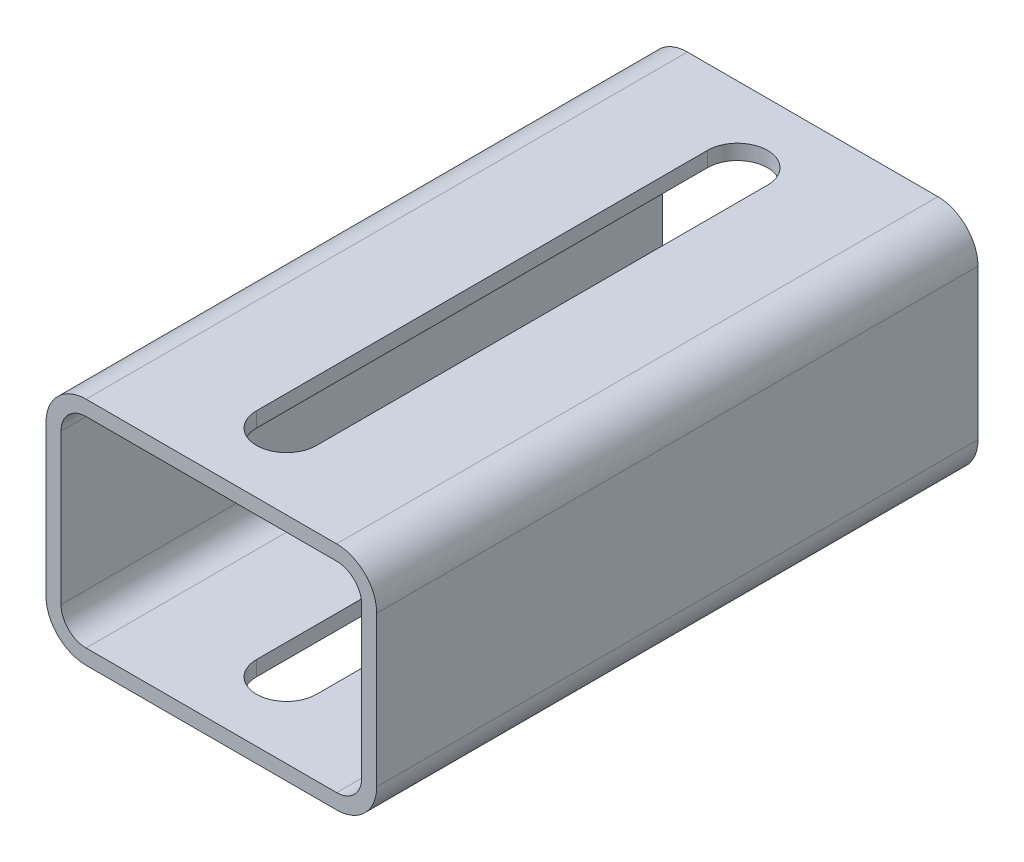
ISO-10303-21;
HEADER;
FILE_DESCRIPTION(('STEP AP214'),'2;1');
FILE_NAME('part.step','',(''),(''),'','','');
FILE_SCHEMA(('AUTOMOTIVE_DESIGN { 1 0 10303 214 1 1 1 1 }'));
ENDSEC;
DATA;
#1=APPLICATION_CONTEXT('core data for automotive mechanical design processes');
#2=APPLICATION_PROTOCOL_DEFINITION('international standard','automotive_design',2000,#1);
#3=PRODUCT_CONTEXT('',#1,'mechanical');
#4=PRODUCT('Part','Part','',(#3));
#5=PRODUCT_RELATED_PRODUCT_CATEGORY('part','',(#4));
#6=PRODUCT_DEFINITION_FORMATION('','',#4);
#7=PRODUCT_DEFINITION_CONTEXT('part definition',#1,'design');
#8=PRODUCT_DEFINITION('design','',#6,#7);
#9=PRODUCT_DEFINITION_SHAPE('','',#8);
#10=(LENGTH_UNIT() NAMED_UNIT(*) SI_UNIT(.MILLI.,.METRE.));
#11=(NAMED_UNIT(*) PLANE_ANGLE_UNIT() SI_UNIT($,.RADIAN.));
#12=(NAMED_UNIT(*) SI_UNIT($,.STERADIAN.) SOLID_ANGLE_UNIT());
#13=UNCERTAINTY_MEASURE_WITH_UNIT(LENGTH_MEASURE(1.E-05),#10,'distance_accuracy_value','');
#14=(GEOMETRIC_REPRESENTATION_CONTEXT(3) GLOBAL_UNCERTAINTY_ASSIGNED_CONTEXT((#13)) GLOBAL_UNIT_ASSIGNED_CONTEXT((#10,
#11,#12)) REPRESENTATION_CONTEXT('',''));
#15=CARTESIAN_POINT('',(0.,0.,0.));
#16=DIRECTION('',(0.,0.,1.));
#17=DIRECTION('',(1.,0.,0.));
#18=AXIS2_PLACEMENT_3D('',#15,#16,#17);
#19=CARTESIAN_POINT('',(25.,15.,60.));
#20=DIRECTION('',(0.,0.,-1.));
#21=DIRECTION('',(-1.,0.,0.));
#22=AXIS2_PLACEMENT_3D('',#19,#20,#21);
#23=PLANE('',#22);
#24=CARTESIAN_POINT('',(25.,15.,60.));
#25=DIRECTION('',(0.,0.,-1.));
#26=DIRECTION('',(-1.,0.,0.));
#27=AXIS2_PLACEMENT_3D('',#24,#25,#26);
#28=CIRCLE('',#27,8.);
#29=CARTESIAN_POINT('',(33.,15.,60.));
#30=VERTEX_POINT('',#29);
#31=CARTESIAN_POINT('',(25.,23.,60.));
#32=VERTEX_POINT('',#31);
#33=EDGE_CURVE('E403',#30,#32,#28,.F.);
#34=ORIENTED_EDGE('',*,*,#33,.T.);
#35=DIRECTION('',(-1.,0.,0.));
#36=VECTOR('',#35,1.);
#37=CARTESIAN_POINT('',(25.,23.,60.));
#38=LINE('',#37,#36);
#39=CARTESIAN_POINT('',(-25.,23.,60.));
#40=VERTEX_POINT('',#39);
#41=EDGE_CURVE('E407',#32,#40,#38,.T.);
#42=ORIENTED_EDGE('',*,*,#41,.T.);
#43=CARTESIAN_POINT('',(-25.,15.,60.));
#44=DIRECTION('',(0.,0.,-1.));
#45=DIRECTION('',(-1.,0.,0.));
#46=AXIS2_PLACEMENT_3D('',#43,#44,#45);
#47=CIRCLE('',#46,8.);
#48=CARTESIAN_POINT('',(-33.,15.,60.));
#49=VERTEX_POINT('',#48);
#50=EDGE_CURVE('E411',#40,#49,#47,.F.);
#51=ORIENTED_EDGE('',*,*,#50,.T.);
#52=DIRECTION('',(0.,-1.,0.));
#53=VECTOR('',#52,1.);
#54=CARTESIAN_POINT('',(-33.,15.,60.));
#55=LINE('',#54,#53);
#56=CARTESIAN_POINT('',(-33.,-15.,60.));
#57=VERTEX_POINT('',#56);
#58=EDGE_CURVE('E414',#49,#57,#55,.T.);
#59=ORIENTED_EDGE('',*,*,#58,.T.);
#60=CARTESIAN_POINT('',(-25.,-15.,60.));
#61=DIRECTION('',(0.,0.,-1.));
#62=DIRECTION('',(-1.,0.,0.));
#63=AXIS2_PLACEMENT_3D('',#60,#61,#62);
#64=CIRCLE('',#63,8.);
#65=CARTESIAN_POINT('',(-25.,-23.,60.));
#66=VERTEX_POINT('',#65);
#67=EDGE_CURVE('E417',#57,#66,#64,.F.);
#68=ORIENTED_EDGE('',*,*,#67,.T.);
#69=DIRECTION('',(1.,0.,0.));
#70=VECTOR('',#69,1.);
#71=CARTESIAN_POINT('',(25.,-23.,60.));
#72=LINE('',#71,#70);
#73=CARTESIAN_POINT('',(25.,-23.,60.));
#74=VERTEX_POINT('',#73);
#75=EDGE_CURVE('E420',#66,#74,#72,.T.);
#76=ORIENTED_EDGE('',*,*,#75,.T.);
#77=CARTESIAN_POINT('',(25.,-15.,60.));
#78=DIRECTION('',(0.,0.,-1.));
#79=DIRECTION('',(-1.,0.,0.));
#80=AXIS2_PLACEMENT_3D('',#77,#78,#79);
#81=CIRCLE('',#80,8.00000000000001);
#82=CARTESIAN_POINT('',(33.,-15.,60.));
#83=VERTEX_POINT('',#82);
#84=EDGE_CURVE('E423',#74,#83,#81,.F.);
#85=ORIENTED_EDGE('',*,*,#84,.T.);
#86=DIRECTION('',(0.,1.,0.));
#87=VECTOR('',#86,1.);
#88=CARTESIAN_POINT('',(33.,15.,60.));
#89=LINE('',#88,#87);
#90=EDGE_CURVE('E426',#83,#30,#89,.T.);
#91=ORIENTED_EDGE('',*,*,#90,.T.);
#92=EDGE_LOOP('',(#34,#42,#51,#59,#68,#76,#85,#91));
#93=FACE_BOUND('',#92,.T.);
#94=CARTESIAN_POINT('',(25.,15.,60.));
#95=DIRECTION('',(0.,0.,1.));
#96=DIRECTION('',(-1.,0.,0.));
#97=AXIS2_PLACEMENT_3D('',#94,#95,#96);
#98=CIRCLE('',#97,5.);
#99=CARTESIAN_POINT('',(30.,15.,60.));
#100=VERTEX_POINT('',#99);
#101=CARTESIAN_POINT('',(25.,20.,60.));
#102=VERTEX_POINT('',#101);
#103=EDGE_CURVE('E320',#100,#102,#98,.T.);
#104=ORIENTED_EDGE('',*,*,#103,.F.);
#105=DIRECTION('',(0.,1.,0.));
#106=VECTOR('',#105,1.);
#107=CARTESIAN_POINT('',(30.,15.,60.));
#108=LINE('',#107,#106);
#109=CARTESIAN_POINT('',(30.,-15.,60.));
#110=VERTEX_POINT('',#109);
#111=EDGE_CURVE('E343',#110,#100,#108,.T.);
#112=ORIENTED_EDGE('',*,*,#111,.F.);
#113=CARTESIAN_POINT('',(25.,-15.,60.));
#114=DIRECTION('',(0.,0.,1.));
#115=DIRECTION('',(1.,0.,0.));
#116=AXIS2_PLACEMENT_3D('',#113,#114,#115);
#117=CIRCLE('',#116,5.00000000000001);
#118=CARTESIAN_POINT('',(25.,-20.,60.));
#119=VERTEX_POINT('',#118);
#120=EDGE_CURVE('E339',#119,#110,#117,.T.);
#121=ORIENTED_EDGE('',*,*,#120,.F.);
#122=DIRECTION('',(1.,0.,0.));
#123=VECTOR('',#122,1.);
#124=CARTESIAN_POINT('',(-25.,-20.,60.));
#125=LINE('',#124,#123);
#126=CARTESIAN_POINT('',(-25.,-20.,60.));
#127=VERTEX_POINT('',#126);
#128=EDGE_CURVE('E336',#127,#119,#125,.T.);
#129=ORIENTED_EDGE('',*,*,#128,.F.);
#130=CARTESIAN_POINT('',(-25.,-15.,60.));
#131=DIRECTION('',(0.,0.,1.));
#132=DIRECTION('',(1.,0.,0.));
#133=AXIS2_PLACEMENT_3D('',#130,#131,#132);
#134=CIRCLE('',#133,5.);
#135=CARTESIAN_POINT('',(-30.,-15.,60.));
#136=VERTEX_POINT('',#135);
#137=EDGE_CURVE('E333',#136,#127,#134,.T.);
#138=ORIENTED_EDGE('',*,*,#137,.F.);
#139=DIRECTION('',(0.,-1.,0.));
#140=VECTOR('',#139,1.);
#141=CARTESIAN_POINT('',(-30.,15.,60.));
#142=LINE('',#141,#140);
#143=CARTESIAN_POINT('',(-30.,15.,60.));
#144=VERTEX_POINT('',#143);
#145=EDGE_CURVE('E330',#144,#136,#142,.T.);
#146=ORIENTED_EDGE('',*,*,#145,.F.);
#147=CARTESIAN_POINT('',(-25.,15.,60.));
#148=DIRECTION('',(0.,0.,1.));
#149=DIRECTION('',(1.,0.,0.));
#150=AXIS2_PLACEMENT_3D('',#147,#148,#149);
#151=CIRCLE('',#150,5.);
#152=CARTESIAN_POINT('',(-25.,20.,60.));
#153=VERTEX_POINT('',#152);
#154=EDGE_CURVE('E327',#153,#144,#151,.T.);
#155=ORIENTED_EDGE('',*,*,#154,.F.);
#156=DIRECTION('',(-1.,0.,0.));
#157=VECTOR('',#156,1.);
#158=CARTESIAN_POINT('',(-25.,20.,60.));
#159=LINE('',#158,#157);
#160=EDGE_CURVE('E323',#102,#153,#159,.T.);
#161=ORIENTED_EDGE('',*,*,#160,.F.);
#162=EDGE_LOOP('',(#104,#112,#121,#129,#138,#146,#155,#161));
#163=FACE_BOUND('',#162,.T.);
#164=ADVANCED_FACE('F86',(#93,#163),#23,.F.);
#165=CARTESIAN_POINT('',(25.,15.,-60.));
#166=DIRECTION('',(0.,0.,-1.));
#167=DIRECTION('',(-1.,0.,0.));
#168=AXIS2_PLACEMENT_3D('',#165,#166,#167);
#169=PLANE('',#168);
#170=CARTESIAN_POINT('',(25.,15.,-60.));
#171=DIRECTION('',(0.,0.,-1.));
#172=DIRECTION('',(-1.,0.,0.));
#173=AXIS2_PLACEMENT_3D('',#170,#171,#172);
#174=CIRCLE('',#173,8.);
#175=CARTESIAN_POINT('',(33.,15.,-60.));
#176=VERTEX_POINT('',#175);
#177=CARTESIAN_POINT('',(25.,23.,-60.));
#178=VERTEX_POINT('',#177);
#179=EDGE_CURVE('E402',#176,#178,#174,.F.);
#180=ORIENTED_EDGE('',*,*,#179,.F.);
#181=DIRECTION('',(0.,1.,0.));
#182=VECTOR('',#181,1.);
#183=CARTESIAN_POINT('',(33.,15.,-60.));
#184=LINE('',#183,#182);
#185=CARTESIAN_POINT('',(33.,-15.,-60.));
#186=VERTEX_POINT('',#185);
#187=EDGE_CURVE('E408',#186,#176,#184,.T.);
#188=ORIENTED_EDGE('',*,*,#187,.F.);
#189=CARTESIAN_POINT('',(25.,-15.,-60.));
#190=DIRECTION('',(0.,0.,-1.));
#191=DIRECTION('',(-1.,0.,0.));
#192=AXIS2_PLACEMENT_3D('',#189,#190,#191);
#193=CIRCLE('',#192,8.00000000000001);
#194=CARTESIAN_POINT('',(25.,-23.,-60.));
#195=VERTEX_POINT('',#194);
#196=EDGE_CURVE('E448',#195,#186,#193,.F.);
#197=ORIENTED_EDGE('',*,*,#196,.F.);
#198=DIRECTION('',(1.,0.,0.));
#199=VECTOR('',#198,1.);
#200=CARTESIAN_POINT('',(25.,-23.,-60.));
#201=LINE('',#200,#199);
#202=CARTESIAN_POINT('',(-25.,-23.,-60.));
#203=VERTEX_POINT('',#202);
#204=EDGE_CURVE('E445',#203,#195,#201,.T.);
#205=ORIENTED_EDGE('',*,*,#204,.F.);
#206=CARTESIAN_POINT('',(-25.,-15.,-60.));
#207=DIRECTION('',(0.,0.,-1.));
#208=DIRECTION('',(-1.,0.,0.));
#209=AXIS2_PLACEMENT_3D('',#206,#207,#208);
#210=CIRCLE('',#209,8.);
#211=CARTESIAN_POINT('',(-33.,-15.,-60.));
#212=VERTEX_POINT('',#211);
#213=EDGE_CURVE('E442',#212,#203,#210,.F.);
#214=ORIENTED_EDGE('',*,*,#213,.F.);
#215=DIRECTION('',(0.,-1.,0.));
#216=VECTOR('',#215,1.);
#217=CARTESIAN_POINT('',(-33.,15.,-60.));
#218=LINE('',#217,#216);
#219=CARTESIAN_POINT('',(-33.,15.,-60.));
#220=VERTEX_POINT('',#219);
#221=EDGE_CURVE('E439',#220,#212,#218,.T.);
#222=ORIENTED_EDGE('',*,*,#221,.F.);
#223=CARTESIAN_POINT('',(-25.,15.,-60.));
#224=DIRECTION('',(0.,0.,-1.));
#225=DIRECTION('',(-1.,0.,0.));
#226=AXIS2_PLACEMENT_3D('',#223,#224,#225);
#227=CIRCLE('',#226,8.);
#228=CARTESIAN_POINT('',(-25.,23.,-60.));
#229=VERTEX_POINT('',#228);
#230=EDGE_CURVE('E436',#229,#220,#227,.F.);
#231=ORIENTED_EDGE('',*,*,#230,.F.);
#232=DIRECTION('',(-1.,0.,0.));
#233=VECTOR('',#232,1.);
#234=CARTESIAN_POINT('',(25.,23.,-60.));
#235=LINE('',#234,#233);
#236=EDGE_CURVE('E433',#178,#229,#235,.T.);
#237=ORIENTED_EDGE('',*,*,#236,.F.);
#238=EDGE_LOOP('',(#180,#188,#197,#205,#214,#222,#231,#237));
#239=FACE_BOUND('',#238,.T.);
#240=DIRECTION('',(0.,1.,0.));
#241=VECTOR('',#240,1.);
#242=CARTESIAN_POINT('',(30.,15.,-60.));
#243=LINE('',#242,#241);
#244=CARTESIAN_POINT('',(30.,-15.,-60.));
#245=VERTEX_POINT('',#244);
#246=CARTESIAN_POINT('',(30.,15.,-60.));
#247=VERTEX_POINT('',#246);
#248=EDGE_CURVE('E324',#245,#247,#243,.T.);
#249=ORIENTED_EDGE('',*,*,#248,.T.);
#250=CARTESIAN_POINT('',(25.,15.,-60.));
#251=DIRECTION('',(0.,0.,1.));
#252=DIRECTION('',(-1.,0.,0.));
#253=AXIS2_PLACEMENT_3D('',#250,#251,#252);
#254=CIRCLE('',#253,5.);
#255=CARTESIAN_POINT('',(25.,20.,-60.));
#256=VERTEX_POINT('',#255);
#257=EDGE_CURVE('E319',#247,#256,#254,.T.);
#258=ORIENTED_EDGE('',*,*,#257,.T.);
#259=DIRECTION('',(-1.,0.,0.));
#260=VECTOR('',#259,1.);
#261=CARTESIAN_POINT('',(-25.,20.,-60.));
#262=LINE('',#261,#260);
#263=CARTESIAN_POINT('',(-25.,20.,-60.));
#264=VERTEX_POINT('',#263);
#265=EDGE_CURVE('E350',#256,#264,#262,.T.);
#266=ORIENTED_EDGE('',*,*,#265,.T.);
#267=CARTESIAN_POINT('',(-25.,15.,-60.));
#268=DIRECTION('',(0.,0.,1.));
#269=DIRECTION('',(1.,0.,0.));
#270=AXIS2_PLACEMENT_3D('',#267,#268,#269);
#271=CIRCLE('',#270,5.);
#272=CARTESIAN_POINT('',(-30.,15.,-60.));
#273=VERTEX_POINT('',#272);
#274=EDGE_CURVE('E354',#264,#273,#271,.T.);
#275=ORIENTED_EDGE('',*,*,#274,.T.);
#276=DIRECTION('',(0.,-1.,0.));
#277=VECTOR('',#276,1.);
#278=CARTESIAN_POINT('',(-30.,15.,-60.));
#279=LINE('',#278,#277);
#280=CARTESIAN_POINT('',(-30.,-15.,-60.));
#281=VERTEX_POINT('',#280);
#282=EDGE_CURVE('E358',#273,#281,#279,.T.);
#283=ORIENTED_EDGE('',*,*,#282,.T.);
#284=CARTESIAN_POINT('',(-25.,-15.,-60.));
#285=DIRECTION('',(0.,0.,1.));
#286=DIRECTION('',(1.,0.,0.));
#287=AXIS2_PLACEMENT_3D('',#284,#285,#286);
#288=CIRCLE('',#287,5.);
#289=CARTESIAN_POINT('',(-25.,-20.,-60.));
#290=VERTEX_POINT('',#289);
#291=EDGE_CURVE('E362',#281,#290,#288,.T.);
#292=ORIENTED_EDGE('',*,*,#291,.T.);
#293=DIRECTION('',(1.,0.,0.));
#294=VECTOR('',#293,1.);
#295=CARTESIAN_POINT('',(-25.,-20.,-60.));
#296=LINE('',#295,#294);
#297=CARTESIAN_POINT('',(25.,-20.,-60.));
#298=VERTEX_POINT('',#297);
#299=EDGE_CURVE('E366',#290,#298,#296,.T.);
#300=ORIENTED_EDGE('',*,*,#299,.T.);
#301=CARTESIAN_POINT('',(25.,-15.,-60.));
#302=DIRECTION('',(0.,0.,1.));
#303=DIRECTION('',(1.,0.,0.));
#304=AXIS2_PLACEMENT_3D('',#301,#302,#303);
#305=CIRCLE('',#304,5.00000000000001);
#306=EDGE_CURVE('E370',#298,#245,#305,.T.);
#307=ORIENTED_EDGE('',*,*,#306,.T.);
#308=EDGE_LOOP('',(#249,#258,#266,#275,#283,#292,#300,#307));
#309=FACE_BOUND('',#308,.T.);
#310=ADVANCED_FACE('F513',(#239,#309),#169,.T.);
#311=CARTESIAN_POINT('',(25.,15.,60.));
#312=DIRECTION('',(0.,0.,-1.));
#313=DIRECTION('',(-1.,0.,0.));
#314=AXIS2_PLACEMENT_3D('',#311,#312,#313);
#315=CYLINDRICAL_SURFACE('',#314,8.);
#316=ORIENTED_EDGE('',*,*,#179,.T.);
#317=DIRECTION('',(0.,0.,-1.));
#318=VECTOR('',#317,1.);
#319=CARTESIAN_POINT('',(25.,23.,60.));
#320=LINE('',#319,#318);
#321=EDGE_CURVE('E480',#32,#178,#320,.T.);
#322=ORIENTED_EDGE('',*,*,#321,.F.);
#323=ORIENTED_EDGE('',*,*,#33,.F.);
#324=DIRECTION('',(0.,0.,-1.));
#325=VECTOR('',#324,1.);
#326=CARTESIAN_POINT('',(33.,15.,60.));
#327=LINE('',#326,#325);
#328=EDGE_CURVE('E429',#30,#176,#327,.T.);
#329=ORIENTED_EDGE('',*,*,#328,.T.);
#330=EDGE_LOOP('',(#316,#322,#323,#329));
#331=FACE_BOUND('',#330,.T.);
#332=ADVANCED_FACE('F88',(#331),#315,.T.);
#333=CARTESIAN_POINT('',(25.,23.,60.));
#334=DIRECTION('',(0.,-1.,0.));
#335=DIRECTION('',(0.,0.,-1.));
#336=AXIS2_PLACEMENT_3D('',#333,#334,#335);
#337=PLANE('',#336);
#338=DIRECTION('',(0.,0.,1.));
#339=VECTOR('',#338,1.);
#340=CARTESIAN_POINT('',(-6.,23.,-45.));
#341=LINE('',#340,#339);
#342=CARTESIAN_POINT('',(-6.00000000000001,23.,-45.));
#343=VERTEX_POINT('',#342);
#344=CARTESIAN_POINT('',(-5.99999999999999,23.,45.));
#345=VERTEX_POINT('',#344);
#346=EDGE_CURVE('E288',#343,#345,#341,.T.);
#347=ORIENTED_EDGE('',*,*,#346,.F.);
#348=CARTESIAN_POINT('',(0.,23.,-45.));
#349=DIRECTION('',(0.,1.,0.));
#350=DIRECTION('',(0.,0.,1.));
#351=AXIS2_PLACEMENT_3D('',#348,#349,#350);
#352=CIRCLE('',#351,5.99999999999999);
#353=CARTESIAN_POINT('',(5.99999999999997,23.,-45.));
#354=VERTEX_POINT('',#353);
#355=EDGE_CURVE('E102',#354,#343,#352,.T.);
#356=ORIENTED_EDGE('',*,*,#355,.F.);
#357=DIRECTION('',(0.,0.,-1.));
#358=VECTOR('',#357,1.);
#359=CARTESIAN_POINT('',(5.99999999999997,23.,-45.));
#360=LINE('',#359,#358);
#361=CARTESIAN_POINT('',(6.,23.,45.));
#362=VERTEX_POINT('',#361);
#363=EDGE_CURVE('E275',#362,#354,#360,.T.);
#364=ORIENTED_EDGE('',*,*,#363,.F.);
#365=CARTESIAN_POINT('',(0.,23.,45.));
#366=DIRECTION('',(0.,1.,0.));
#367=DIRECTION('',(0.,0.,1.));
#368=AXIS2_PLACEMENT_3D('',#365,#366,#367);
#369=CIRCLE('',#368,5.99999999999999);
#370=EDGE_CURVE('E279',#345,#362,#369,.T.);
#371=ORIENTED_EDGE('',*,*,#370,.F.);
#372=EDGE_LOOP('',(#347,#356,#364,#371));
#373=FACE_BOUND('',#372,.T.);
#374=ORIENTED_EDGE('',*,*,#236,.T.);
#375=DIRECTION('',(0.,0.,-1.));
#376=VECTOR('',#375,1.);
#377=CARTESIAN_POINT('',(-25.,23.,60.));
#378=LINE('',#377,#376);
#379=EDGE_CURVE('E476',#40,#229,#378,.T.);
#380=ORIENTED_EDGE('',*,*,#379,.F.);
#381=ORIENTED_EDGE('',*,*,#41,.F.);
#382=ORIENTED_EDGE('',*,*,#321,.T.);
#383=EDGE_LOOP('',(#374,#380,#381,#382));
#384=FACE_BOUND('',#383,.T.);
#385=ADVANCED_FACE('F546',(#373,#384),#337,.F.);
#386=CARTESIAN_POINT('',(-25.,15.,60.));
#387=DIRECTION('',(0.,0.,-1.));
#388=DIRECTION('',(-1.,0.,0.));
#389=AXIS2_PLACEMENT_3D('',#386,#387,#388);
#390=CYLINDRICAL_SURFACE('',#389,8.);
#391=ORIENTED_EDGE('',*,*,#230,.T.);
#392=DIRECTION('',(0.,0.,-1.));
#393=VECTOR('',#392,1.);
#394=CARTESIAN_POINT('',(-33.,15.,60.));
#395=LINE('',#394,#393);
#396=EDGE_CURVE('E472',#49,#220,#395,.T.);
#397=ORIENTED_EDGE('',*,*,#396,.F.);
#398=ORIENTED_EDGE('',*,*,#50,.F.);
#399=ORIENTED_EDGE('',*,*,#379,.T.);
#400=EDGE_LOOP('',(#391,#397,#398,#399));
#401=FACE_BOUND('',#400,.T.);
#402=ADVANCED_FACE('F543',(#401),#390,.T.);
#403=CARTESIAN_POINT('',(-33.,15.,60.));
#404=DIRECTION('',(1.,0.,0.));
#405=DIRECTION('',(0.,1.,0.));
#406=AXIS2_PLACEMENT_3D('',#403,#404,#405);
#407=PLANE('',#406);
#408=ORIENTED_EDGE('',*,*,#221,.T.);
#409=DIRECTION('',(0.,0.,-1.));
#410=VECTOR('',#409,1.);
#411=CARTESIAN_POINT('',(-33.,-15.,60.));
#412=LINE('',#411,#410);
#413=EDGE_CURVE('E468',#57,#212,#412,.T.);
#414=ORIENTED_EDGE('',*,*,#413,.F.);
#415=ORIENTED_EDGE('',*,*,#58,.F.);
#416=ORIENTED_EDGE('',*,*,#396,.T.);
#417=EDGE_LOOP('',(#408,#414,#415,#416));
#418=FACE_BOUND('',#417,.T.);
#419=ADVANCED_FACE('F539',(#418),#407,.F.);
#420=CARTESIAN_POINT('',(-25.,-15.,60.));
#421=DIRECTION('',(0.,0.,-1.));
#422=DIRECTION('',(-1.,0.,0.));
#423=AXIS2_PLACEMENT_3D('',#420,#421,#422);
#424=CYLINDRICAL_SURFACE('',#423,8.);
#425=ORIENTED_EDGE('',*,*,#213,.T.);
#426=DIRECTION('',(0.,0.,-1.));
#427=VECTOR('',#426,1.);
#428=CARTESIAN_POINT('',(-25.,-23.,60.));
#429=LINE('',#428,#427);
#430=EDGE_CURVE('E464',#66,#203,#429,.T.);
#431=ORIENTED_EDGE('',*,*,#430,.F.);
#432=ORIENTED_EDGE('',*,*,#67,.F.);
#433=ORIENTED_EDGE('',*,*,#413,.T.);
#434=EDGE_LOOP('',(#425,#431,#432,#433));
#435=FACE_BOUND('',#434,.T.);
#436=ADVANCED_FACE('F536',(#435),#424,.T.);
#437=CARTESIAN_POINT('',(25.,-23.,60.));
#438=DIRECTION('',(0.,1.,0.));
#439=DIRECTION('',(0.,0.,1.));
#440=AXIS2_PLACEMENT_3D('',#437,#438,#439);
#441=PLANE('',#440);
#442=DIRECTION('',(0.,0.,-1.));
#443=VECTOR('',#442,1.);
#444=CARTESIAN_POINT('',(5.99999999999997,-23.,-45.));
#445=LINE('',#444,#443);
#446=CARTESIAN_POINT('',(6.,-23.,45.));
#447=VERTEX_POINT('',#446);
#448=CARTESIAN_POINT('',(5.99999999999997,-23.,-45.));
#449=VERTEX_POINT('',#448);
#450=EDGE_CURVE('E273',#447,#449,#445,.T.);
#451=ORIENTED_EDGE('',*,*,#450,.T.);
#452=CARTESIAN_POINT('',(0.,-23.,-45.));
#453=DIRECTION('',(0.,1.,0.));
#454=DIRECTION('',(0.,0.,1.));
#455=AXIS2_PLACEMENT_3D('',#452,#453,#454);
#456=CIRCLE('',#455,5.99999999999999);
#457=CARTESIAN_POINT('',(-6.,-23.,-45.));
#458=VERTEX_POINT('',#457);
#459=EDGE_CURVE('E254',#449,#458,#456,.T.);
#460=ORIENTED_EDGE('',*,*,#459,.T.);
#461=DIRECTION('',(0.,0.,1.));
#462=VECTOR('',#461,1.);
#463=CARTESIAN_POINT('',(-6.,-23.,-45.));
#464=LINE('',#463,#462);
#465=CARTESIAN_POINT('',(-5.99999999999998,-23.,45.));
#466=VERTEX_POINT('',#465);
#467=EDGE_CURVE('E264',#458,#466,#464,.T.);
#468=ORIENTED_EDGE('',*,*,#467,.T.);
#469=CARTESIAN_POINT('',(0.,-23.,45.));
#470=DIRECTION('',(0.,1.,0.));
#471=DIRECTION('',(0.,0.,1.));
#472=AXIS2_PLACEMENT_3D('',#469,#470,#471);
#473=CIRCLE('',#472,5.99999999999999);
#474=EDGE_CURVE('E110',#466,#447,#473,.T.);
#475=ORIENTED_EDGE('',*,*,#474,.T.);
#476=EDGE_LOOP('',(#451,#460,#468,#475));
#477=FACE_BOUND('',#476,.T.);
#478=ORIENTED_EDGE('',*,*,#204,.T.);
#479=DIRECTION('',(0.,0.,-1.));
#480=VECTOR('',#479,1.);
#481=CARTESIAN_POINT('',(25.,-23.,60.));
#482=LINE('',#481,#480);
#483=EDGE_CURVE('E460',#74,#195,#482,.T.);
#484=ORIENTED_EDGE('',*,*,#483,.F.);
#485=ORIENTED_EDGE('',*,*,#75,.F.);
#486=ORIENTED_EDGE('',*,*,#430,.T.);
#487=EDGE_LOOP('',(#478,#484,#485,#486));
#488=FACE_BOUND('',#487,.T.);
#489=ADVANCED_FACE('F270',(#477,#488),#441,.F.);
#490=CARTESIAN_POINT('',(25.,-15.,60.));
#491=DIRECTION('',(0.,0.,-1.));
#492=DIRECTION('',(-1.,0.,0.));
#493=AXIS2_PLACEMENT_3D('',#490,#491,#492);
#494=CYLINDRICAL_SURFACE('',#493,8.00000000000001);
#495=ORIENTED_EDGE('',*,*,#196,.T.);
#496=DIRECTION('',(0.,0.,-1.));
#497=VECTOR('',#496,1.);
#498=CARTESIAN_POINT('',(33.,-15.,60.));
#499=LINE('',#498,#497);
#500=EDGE_CURVE('E456',#83,#186,#499,.T.);
#501=ORIENTED_EDGE('',*,*,#500,.F.);
#502=ORIENTED_EDGE('',*,*,#84,.F.);
#503=ORIENTED_EDGE('',*,*,#483,.T.);
#504=EDGE_LOOP('',(#495,#501,#502,#503));
#505=FACE_BOUND('',#504,.T.);
#506=ADVANCED_FACE('F529',(#505),#494,.T.);
#507=CARTESIAN_POINT('',(33.,15.,60.));
#508=DIRECTION('',(-1.,0.,0.));
#509=DIRECTION('',(0.,-1.,0.));
#510=AXIS2_PLACEMENT_3D('',#507,#508,#509);
#511=PLANE('',#510);
#512=ORIENTED_EDGE('',*,*,#187,.T.);
#513=ORIENTED_EDGE('',*,*,#328,.F.);
#514=ORIENTED_EDGE('',*,*,#90,.F.);
#515=ORIENTED_EDGE('',*,*,#500,.T.);
#516=EDGE_LOOP('',(#512,#513,#514,#515));
#517=FACE_BOUND('',#516,.T.);
#518=ADVANCED_FACE('F526',(#517),#511,.F.);
#519=CARTESIAN_POINT('',(25.,15.,60.));
#520=DIRECTION('',(0.,0.,-1.));
#521=DIRECTION('',(-1.,0.,0.));
#522=AXIS2_PLACEMENT_3D('',#519,#520,#521);
#523=CYLINDRICAL_SURFACE('',#522,5.);
#524=ORIENTED_EDGE('',*,*,#257,.F.);
#525=DIRECTION('',(0.,0.,-1.));
#526=VECTOR('',#525,1.);
#527=CARTESIAN_POINT('',(30.,15.,60.));
#528=LINE('',#527,#526);
#529=EDGE_CURVE('E346',#100,#247,#528,.T.);
#530=ORIENTED_EDGE('',*,*,#529,.F.);
#531=ORIENTED_EDGE('',*,*,#103,.T.);
#532=DIRECTION('',(0.,0.,-1.));
#533=VECTOR('',#532,1.);
#534=CARTESIAN_POINT('',(25.,20.,60.));
#535=LINE('',#534,#533);
#536=EDGE_CURVE('E398',#102,#256,#535,.T.);
#537=ORIENTED_EDGE('',*,*,#536,.T.);
#538=EDGE_LOOP('',(#524,#530,#531,#537));
#539=FACE_BOUND('',#538,.T.);
#540=ADVANCED_FACE('F523',(#539),#523,.F.);
#541=CARTESIAN_POINT('',(-25.,20.,60.));
#542=DIRECTION('',(0.,-1.,0.));
#543=DIRECTION('',(0.,0.,-1.));
#544=AXIS2_PLACEMENT_3D('',#541,#542,#543);
#545=PLANE('',#544);
#546=CARTESIAN_POINT('',(0.,20.,-45.));
#547=DIRECTION('',(0.,-1.,0.));
#548=DIRECTION('',(0.,0.,-1.));
#549=AXIS2_PLACEMENT_3D('',#546,#547,#548);
#550=CIRCLE('',#549,5.99999999999999);
#551=CARTESIAN_POINT('',(-6.,20.,-45.));
#552=VERTEX_POINT('',#551);
#553=CARTESIAN_POINT('',(5.99999999999997,20.,-45.));
#554=VERTEX_POINT('',#553);
#555=EDGE_CURVE('E316',#552,#554,#550,.T.);
#556=ORIENTED_EDGE('',*,*,#555,.F.);
#557=DIRECTION('',(0.,0.,-1.));
#558=VECTOR('',#557,1.);
#559=CARTESIAN_POINT('',(-5.99999999999997,20.,60.));
#560=LINE('',#559,#558);
#561=CARTESIAN_POINT('',(-5.99999999999998,20.,45.));
#562=VERTEX_POINT('',#561);
#563=EDGE_CURVE('E298',#562,#552,#560,.T.);
#564=ORIENTED_EDGE('',*,*,#563,.F.);
#565=CARTESIAN_POINT('',(0.,20.,45.));
#566=DIRECTION('',(0.,-1.,0.));
#567=DIRECTION('',(0.,0.,-1.));
#568=AXIS2_PLACEMENT_3D('',#565,#566,#567);
#569=CIRCLE('',#568,5.99999999999999);
#570=CARTESIAN_POINT('',(6.,20.,45.));
#571=VERTEX_POINT('',#570);
#572=EDGE_CURVE('E309',#571,#562,#569,.T.);
#573=ORIENTED_EDGE('',*,*,#572,.F.);
#574=DIRECTION('',(0.,0.,1.));
#575=VECTOR('',#574,1.);
#576=CARTESIAN_POINT('',(6.,20.,60.));
#577=LINE('',#576,#575);
#578=EDGE_CURVE('E313',#554,#571,#577,.T.);
#579=ORIENTED_EDGE('',*,*,#578,.F.);
#580=EDGE_LOOP('',(#556,#564,#573,#579));
#581=FACE_BOUND('',#580,.T.);
#582=ORIENTED_EDGE('',*,*,#265,.F.);
#583=ORIENTED_EDGE('',*,*,#536,.F.);
#584=ORIENTED_EDGE('',*,*,#160,.T.);
#585=DIRECTION('',(0.,0.,-1.));
#586=VECTOR('',#585,1.);
#587=CARTESIAN_POINT('',(-25.,20.,60.));
#588=LINE('',#587,#586);
#589=EDGE_CURVE('E395',#153,#264,#588,.T.);
#590=ORIENTED_EDGE('',*,*,#589,.T.);
#591=EDGE_LOOP('',(#582,#583,#584,#590));
#592=FACE_BOUND('',#591,.T.);
#593=ADVANCED_FACE('F594',(#581,#592),#545,.T.);
#594=CARTESIAN_POINT('',(-25.,15.,60.));
#595=DIRECTION('',(0.,0.,-1.));
#596=DIRECTION('',(-1.,0.,0.));
#597=AXIS2_PLACEMENT_3D('',#594,#595,#596);
#598=CYLINDRICAL_SURFACE('',#597,5.);
#599=ORIENTED_EDGE('',*,*,#274,.F.);
#600=ORIENTED_EDGE('',*,*,#589,.F.);
#601=ORIENTED_EDGE('',*,*,#154,.T.);
#602=DIRECTION('',(0.,0.,-1.));
#603=VECTOR('',#602,1.);
#604=CARTESIAN_POINT('',(-30.,15.,60.));
#605=LINE('',#604,#603);
#606=EDGE_CURVE('E392',#144,#273,#605,.T.);
#607=ORIENTED_EDGE('',*,*,#606,.T.);
#608=EDGE_LOOP('',(#599,#600,#601,#607));
#609=FACE_BOUND('',#608,.T.);
#610=ADVANCED_FACE('F597',(#609),#598,.F.);
#611=CARTESIAN_POINT('',(-30.,15.,60.));
#612=DIRECTION('',(1.,0.,0.));
#613=DIRECTION('',(0.,1.,0.));
#614=AXIS2_PLACEMENT_3D('',#611,#612,#613);
#615=PLANE('',#614);
#616=ORIENTED_EDGE('',*,*,#282,.F.);
#617=ORIENTED_EDGE('',*,*,#606,.F.);
#618=ORIENTED_EDGE('',*,*,#145,.T.);
#619=DIRECTION('',(0.,0.,-1.));
#620=VECTOR('',#619,1.);
#621=CARTESIAN_POINT('',(-30.,-15.,60.));
#622=LINE('',#621,#620);
#623=EDGE_CURVE('E389',#136,#281,#622,.T.);
#624=ORIENTED_EDGE('',*,*,#623,.T.);
#625=EDGE_LOOP('',(#616,#617,#618,#624));
#626=FACE_BOUND('',#625,.T.);
#627=ADVANCED_FACE('F602',(#626),#615,.T.);
#628=CARTESIAN_POINT('',(-25.,-15.,60.));
#629=DIRECTION('',(0.,0.,-1.));
#630=DIRECTION('',(-1.,0.,0.));
#631=AXIS2_PLACEMENT_3D('',#628,#629,#630);
#632=CYLINDRICAL_SURFACE('',#631,5.);
#633=ORIENTED_EDGE('',*,*,#291,.F.);
#634=ORIENTED_EDGE('',*,*,#623,.F.);
#635=ORIENTED_EDGE('',*,*,#137,.T.);
#636=DIRECTION('',(0.,0.,-1.));
#637=VECTOR('',#636,1.);
#638=CARTESIAN_POINT('',(-25.,-20.,60.));
#639=LINE('',#638,#637);
#640=EDGE_CURVE('E386',#127,#290,#639,.T.);
#641=ORIENTED_EDGE('',*,*,#640,.T.);
#642=EDGE_LOOP('',(#633,#634,#635,#641));
#643=FACE_BOUND('',#642,.T.);
#644=ADVANCED_FACE('F606',(#643),#632,.F.);
#645=CARTESIAN_POINT('',(-25.,-20.,60.));
#646=DIRECTION('',(0.,1.,0.));
#647=DIRECTION('',(0.,0.,1.));
#648=AXIS2_PLACEMENT_3D('',#645,#646,#647);
#649=PLANE('',#648);
#650=CARTESIAN_POINT('',(0.,-20.,-45.));
#651=DIRECTION('',(0.,1.,0.));
#652=DIRECTION('',(0.,0.,1.));
#653=AXIS2_PLACEMENT_3D('',#650,#651,#652);
#654=CIRCLE('',#653,5.99999999999999);
#655=CARTESIAN_POINT('',(5.99999999999997,-20.,-45.));
#656=VERTEX_POINT('',#655);
#657=CARTESIAN_POINT('',(-6.00000000000001,-20.,-45.));
#658=VERTEX_POINT('',#657);
#659=EDGE_CURVE('E12',#656,#658,#654,.T.);
#660=ORIENTED_EDGE('',*,*,#659,.F.);
#661=DIRECTION('',(0.,0.,-1.));
#662=VECTOR('',#661,1.);
#663=CARTESIAN_POINT('',(6.,-20.,60.));
#664=LINE('',#663,#662);
#665=CARTESIAN_POINT('',(6.,-20.,45.));
#666=VERTEX_POINT('',#665);
#667=EDGE_CURVE('E95',#666,#656,#664,.T.);
#668=ORIENTED_EDGE('',*,*,#667,.F.);
#669=CARTESIAN_POINT('',(0.,-20.,45.));
#670=DIRECTION('',(0.,1.,0.));
#671=DIRECTION('',(0.,0.,1.));
#672=AXIS2_PLACEMENT_3D('',#669,#670,#671);
#673=CIRCLE('',#672,5.99999999999999);
#674=CARTESIAN_POINT('',(-5.99999999999999,-20.,45.));
#675=VERTEX_POINT('',#674);
#676=EDGE_CURVE('E487',#675,#666,#673,.T.);
#677=ORIENTED_EDGE('',*,*,#676,.F.);
#678=DIRECTION('',(0.,0.,1.));
#679=VECTOR('',#678,1.);
#680=CARTESIAN_POINT('',(-5.99999999999997,-20.,60.));
#681=LINE('',#680,#679);
#682=EDGE_CURVE('E484',#658,#675,#681,.T.);
#683=ORIENTED_EDGE('',*,*,#682,.F.);
#684=EDGE_LOOP('',(#660,#668,#677,#683));
#685=FACE_BOUND('',#684,.T.);
#686=ORIENTED_EDGE('',*,*,#299,.F.);
#687=ORIENTED_EDGE('',*,*,#640,.F.);
#688=ORIENTED_EDGE('',*,*,#128,.T.);
#689=DIRECTION('',(0.,0.,-1.));
#690=VECTOR('',#689,1.);
#691=CARTESIAN_POINT('',(25.,-20.,60.));
#692=LINE('',#691,#690);
#693=EDGE_CURVE('E383',#119,#298,#692,.T.);
#694=ORIENTED_EDGE('',*,*,#693,.T.);
#695=EDGE_LOOP('',(#686,#687,#688,#694));
#696=FACE_BOUND('',#695,.T.);
#697=ADVANCED_FACE('F495',(#685,#696),#649,.T.);
#698=CARTESIAN_POINT('',(25.,-15.,60.));
#699=DIRECTION('',(0.,0.,-1.));
#700=DIRECTION('',(-1.,0.,0.));
#701=AXIS2_PLACEMENT_3D('',#698,#699,#700);
#702=CYLINDRICAL_SURFACE('',#701,5.00000000000001);
#703=ORIENTED_EDGE('',*,*,#306,.F.);
#704=ORIENTED_EDGE('',*,*,#693,.F.);
#705=ORIENTED_EDGE('',*,*,#120,.T.);
#706=DIRECTION('',(0.,0.,-1.));
#707=VECTOR('',#706,1.);
#708=CARTESIAN_POINT('',(30.,-15.,60.));
#709=LINE('',#708,#707);
#710=EDGE_CURVE('E380',#110,#245,#709,.T.);
#711=ORIENTED_EDGE('',*,*,#710,.T.);
#712=EDGE_LOOP('',(#703,#704,#705,#711));
#713=FACE_BOUND('',#712,.T.);
#714=ADVANCED_FACE('F612',(#713),#702,.F.);
#715=CARTESIAN_POINT('',(30.,15.,60.));
#716=DIRECTION('',(-1.,0.,0.));
#717=DIRECTION('',(0.,-1.,0.));
#718=AXIS2_PLACEMENT_3D('',#715,#716,#717);
#719=PLANE('',#718);
#720=ORIENTED_EDGE('',*,*,#248,.F.);
#721=ORIENTED_EDGE('',*,*,#710,.F.);
#722=ORIENTED_EDGE('',*,*,#111,.T.);
#723=ORIENTED_EDGE('',*,*,#529,.T.);
#724=EDGE_LOOP('',(#720,#721,#722,#723));
#725=FACE_BOUND('',#724,.T.);
#726=ADVANCED_FACE('F507',(#725),#719,.T.);
#727=CARTESIAN_POINT('',(-6.,-23.,-45.));
#728=DIRECTION('',(-1.,0.,0.));
#729=DIRECTION('',(0.,0.,1.));
#730=AXIS2_PLACEMENT_3D('',#727,#728,#729);
#731=PLANE('',#730);
#732=ORIENTED_EDGE('',*,*,#682,.T.);
#733=DIRECTION('',(0.,1.,0.));
#734=VECTOR('',#733,1.);
#735=CARTESIAN_POINT('',(-5.99999999999999,-23.,45.));
#736=LINE('',#735,#734);
#737=EDGE_CURVE('E266',#466,#675,#736,.T.);
#738=ORIENTED_EDGE('',*,*,#737,.F.);
#739=ORIENTED_EDGE('',*,*,#467,.F.);
#740=DIRECTION('',(0.,1.,0.));
#741=VECTOR('',#740,1.);
#742=CARTESIAN_POINT('',(-6.,-23.,-45.));
#743=LINE('',#742,#741);
#744=EDGE_CURVE('E249',#458,#658,#743,.T.);
#745=ORIENTED_EDGE('',*,*,#744,.T.);
#746=EDGE_LOOP('',(#732,#738,#739,#745));
#747=FACE_BOUND('',#746,.T.);
#748=ADVANCED_FACE('F265',(#747),#731,.F.);
#749=CARTESIAN_POINT('',(0.,-23.,45.));
#750=DIRECTION('',(0.,1.,0.));
#751=DIRECTION('',(0.,0.,1.));
#752=AXIS2_PLACEMENT_3D('',#749,#750,#751);
#753=CYLINDRICAL_SURFACE('',#752,5.99999999999999);
#754=ORIENTED_EDGE('',*,*,#676,.T.);
#755=DIRECTION('',(0.,1.,0.));
#756=VECTOR('',#755,1.);
#757=CARTESIAN_POINT('',(6.,-23.,45.));
#758=LINE('',#757,#756);
#759=EDGE_CURVE('E300',#447,#666,#758,.T.);
#760=ORIENTED_EDGE('',*,*,#759,.F.);
#761=ORIENTED_EDGE('',*,*,#474,.F.);
#762=ORIENTED_EDGE('',*,*,#737,.T.);
#763=EDGE_LOOP('',(#754,#760,#761,#762));
#764=FACE_BOUND('',#763,.T.);
#765=ADVANCED_FACE('F497',(#764),#753,.F.);
#766=CARTESIAN_POINT('',(5.99999999999997,-23.,-45.));
#767=DIRECTION('',(1.,0.,0.));
#768=DIRECTION('',(0.,0.,-1.));
#769=AXIS2_PLACEMENT_3D('',#766,#767,#768);
#770=PLANE('',#769);
#771=ORIENTED_EDGE('',*,*,#667,.T.);
#772=DIRECTION('',(0.,1.,0.));
#773=VECTOR('',#772,1.);
#774=CARTESIAN_POINT('',(5.99999999999997,-23.,-45.));
#775=LINE('',#774,#773);
#776=EDGE_CURVE('E295',#449,#656,#775,.T.);
#777=ORIENTED_EDGE('',*,*,#776,.F.);
#778=ORIENTED_EDGE('',*,*,#450,.F.);
#779=ORIENTED_EDGE('',*,*,#759,.T.);
#780=EDGE_LOOP('',(#771,#777,#778,#779));
#781=FACE_BOUND('',#780,.T.);
#782=ADVANCED_FACE('F492',(#781),#770,.F.);
#783=CARTESIAN_POINT('',(0.,-23.,-45.));
#784=DIRECTION('',(0.,1.,0.));
#785=DIRECTION('',(0.,0.,1.));
#786=AXIS2_PLACEMENT_3D('',#783,#784,#785);
#787=CYLINDRICAL_SURFACE('',#786,5.99999999999999);
#788=ORIENTED_EDGE('',*,*,#659,.T.);
#789=ORIENTED_EDGE('',*,*,#744,.F.);
#790=ORIENTED_EDGE('',*,*,#459,.F.);
#791=ORIENTED_EDGE('',*,*,#776,.T.);
#792=EDGE_LOOP('',(#788,#789,#790,#791));
#793=FACE_BOUND('',#792,.T.);
#794=ADVANCED_FACE('F251',(#793),#787,.F.);
#795=ORIENTED_EDGE('',*,*,#555,.T.);
#796=EDGE_CURVE('E299',#554,#354,#775,.T.);
#797=ORIENTED_EDGE('',*,*,#796,.T.);
#798=ORIENTED_EDGE('',*,*,#355,.T.);
#799=EDGE_CURVE('E261',#552,#343,#743,.T.);
#800=ORIENTED_EDGE('',*,*,#799,.F.);
#801=EDGE_LOOP('',(#795,#797,#798,#800));
#802=FACE_BOUND('',#801,.T.);
#803=ADVANCED_FACE('F638',(#802),#787,.F.);
#804=ORIENTED_EDGE('',*,*,#578,.T.);
#805=EDGE_CURVE('E304',#571,#362,#758,.T.);
#806=ORIENTED_EDGE('',*,*,#805,.T.);
#807=ORIENTED_EDGE('',*,*,#363,.T.);
#808=ORIENTED_EDGE('',*,*,#796,.F.);
#809=EDGE_LOOP('',(#804,#806,#807,#808));
#810=FACE_BOUND('',#809,.T.);
#811=ADVANCED_FACE('F506',(#810),#770,.F.);
#812=ORIENTED_EDGE('',*,*,#572,.T.);
#813=EDGE_CURVE('E260',#562,#345,#736,.T.);
#814=ORIENTED_EDGE('',*,*,#813,.T.);
#815=ORIENTED_EDGE('',*,*,#370,.T.);
#816=ORIENTED_EDGE('',*,*,#805,.F.);
#817=EDGE_LOOP('',(#812,#814,#815,#816));
#818=FACE_BOUND('',#817,.T.);
#819=ADVANCED_FACE('F500',(#818),#753,.F.);
#820=ORIENTED_EDGE('',*,*,#563,.T.);
#821=ORIENTED_EDGE('',*,*,#799,.T.);
#822=ORIENTED_EDGE('',*,*,#346,.T.);
#823=ORIENTED_EDGE('',*,*,#813,.F.);
#824=EDGE_LOOP('',(#820,#821,#822,#823));
#825=FACE_BOUND('',#824,.T.);
#826=ADVANCED_FACE('F509',(#825),#731,.F.);
#827=CLOSED_SHELL('',(#164,#310,#332,#385,#402,#419,#436,#489,#506,#518,#540,#593,#610,#627,
#644,#697,#714,#726,#748,#765,#782,#794,#803,#811,#819,#826));
#828=MANIFOLD_SOLID_BREP('B2',#827);
#829=ADVANCED_BREP_SHAPE_REPRESENTATION('',(#18,#828),#14);
#830=SHAPE_DEFINITION_REPRESENTATION(#9,#829);
ENDSEC;
END-ISO-10303-21;
